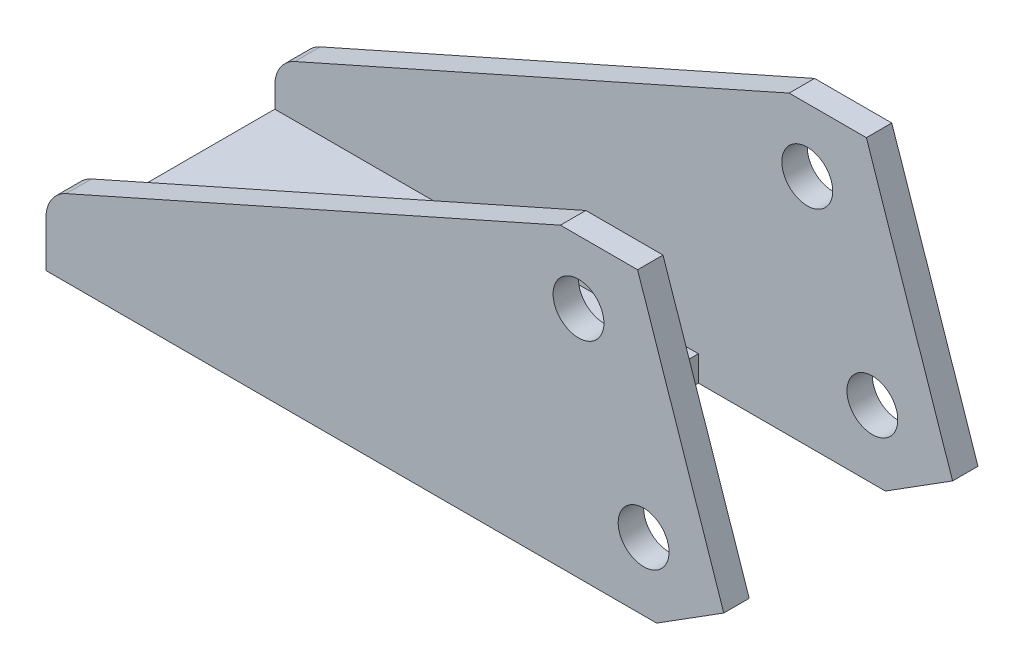
ISO-10303-21;
HEADER;
FILE_DESCRIPTION(('STEP AP214'),'2;1');
FILE_NAME('part.step','',(''),(''),'','','');
FILE_SCHEMA(('AUTOMOTIVE_DESIGN { 1 0 10303 214 1 1 1 1 }'));
ENDSEC;
DATA;
#1=APPLICATION_CONTEXT('core data for automotive mechanical design processes');
#2=APPLICATION_PROTOCOL_DEFINITION('international standard','automotive_design',2000,#1);
#3=PRODUCT_CONTEXT('',#1,'mechanical');
#4=PRODUCT('Part','Part','',(#3));
#5=PRODUCT_RELATED_PRODUCT_CATEGORY('part','',(#4));
#6=PRODUCT_DEFINITION_FORMATION('','',#4);
#7=PRODUCT_DEFINITION_CONTEXT('part definition',#1,'design');
#8=PRODUCT_DEFINITION('design','',#6,#7);
#9=PRODUCT_DEFINITION_SHAPE('','',#8);
#10=(LENGTH_UNIT() NAMED_UNIT(*) SI_UNIT(.MILLI.,.METRE.));
#11=(NAMED_UNIT(*) PLANE_ANGLE_UNIT() SI_UNIT($,.RADIAN.));
#12=(NAMED_UNIT(*) SI_UNIT($,.STERADIAN.) SOLID_ANGLE_UNIT());
#13=UNCERTAINTY_MEASURE_WITH_UNIT(LENGTH_MEASURE(1.E-05),#10,'distance_accuracy_value','');
#14=(GEOMETRIC_REPRESENTATION_CONTEXT(3) GLOBAL_UNCERTAINTY_ASSIGNED_CONTEXT((#13)) GLOBAL_UNIT_ASSIGNED_CONTEXT((#10,
#11,#12)) REPRESENTATION_CONTEXT('',''));
#15=CARTESIAN_POINT('',(0.,0.,0.));
#16=DIRECTION('',(0.,0.,1.));
#17=DIRECTION('',(1.,0.,0.));
#18=AXIS2_PLACEMENT_3D('',#15,#16,#17);
#19=CARTESIAN_POINT('',(1.18729583152566,4.52801946219611,15.));
#20=DIRECTION('',(0.406352084237173,-0.913716577301794,0.));
#21=DIRECTION('',(0.913716577301794,0.406352084237173,0.));
#22=AXIS2_PLACEMENT_3D('',#19,#20,#21);
#23=PLANE('',#22);
#24=DIRECTION('',(-0.913716577301794,-0.406352084237173,0.));
#25=VECTOR('',#24,1.);
#26=CARTESIAN_POINT('',(1.18729583152566,4.52801946219611,13.5));
#27=LINE('',#26,#25);
#28=CARTESIAN_POINT('',(30.3558767681246,17.5,13.5));
#29=VERTEX_POINT('',#28);
#30=CARTESIAN_POINT('',(1.18729583152566,4.52801946219611,13.5));
#31=VERTEX_POINT('',#30);
#32=EDGE_CURVE('E192',#29,#31,#27,.T.);
#33=ORIENTED_EDGE('',*,*,#32,.T.);
#34=DIRECTION('',(0.,0.,-1.));
#35=VECTOR('',#34,1.);
#36=CARTESIAN_POINT('',(1.18729583152566,4.52801946219611,15.));
#37=LINE('',#36,#35);
#38=CARTESIAN_POINT('',(1.18729583152566,4.52801946219611,15.));
#39=VERTEX_POINT('',#38);
#40=EDGE_CURVE('E256',#39,#31,#37,.T.);
#41=ORIENTED_EDGE('',*,*,#40,.F.);
#42=DIRECTION('',(-0.913716577301794,-0.406352084237173,0.));
#43=VECTOR('',#42,1.);
#44=CARTESIAN_POINT('',(1.18729583152566,4.52801946219611,15.));
#45=LINE('',#44,#43);
#46=CARTESIAN_POINT('',(30.3558767681246,17.5,15.));
#47=VERTEX_POINT('',#46);
#48=EDGE_CURVE('E228',#47,#39,#45,.T.);
#49=ORIENTED_EDGE('',*,*,#48,.F.);
#50=DIRECTION('',(0.,0.,-1.));
#51=VECTOR('',#50,1.);
#52=CARTESIAN_POINT('',(30.3558767681246,17.5,15.));
#53=LINE('',#52,#51);
#54=EDGE_CURVE('E260',#47,#29,#53,.T.);
#55=ORIENTED_EDGE('',*,*,#54,.T.);
#56=EDGE_LOOP('',(#33,#41,#49,#55));
#57=FACE_BOUND('',#56,.T.);
#58=ADVANCED_FACE('F32',(#57),#23,.F.);
#59=CARTESIAN_POINT('',(2.,2.70058630759251,15.));
#60=DIRECTION('',(0.,0.,-1.));
#61=DIRECTION('',(-1.,0.,0.));
#62=AXIS2_PLACEMENT_3D('',#59,#60,#61);
#63=CYLINDRICAL_SURFACE('',#62,2.);
#64=ORIENTED_EDGE('',*,*,#40,.T.);
#65=CARTESIAN_POINT('',(2.,2.70058630759251,13.5));
#66=DIRECTION('',(0.,0.,1.));
#67=DIRECTION('',(0.,-1.,0.));
#68=AXIS2_PLACEMENT_3D('',#65,#66,#67);
#69=CIRCLE('',#68,2.);
#70=CARTESIAN_POINT('',(0.,2.7005863075925,13.5));
#71=VERTEX_POINT('',#70);
#72=EDGE_CURVE('E295',#31,#71,#69,.T.);
#73=ORIENTED_EDGE('',*,*,#72,.T.);
#74=DIRECTION('',(0.,0.,-1.));
#75=VECTOR('',#74,1.);
#76=CARTESIAN_POINT('',(0.,2.7005863075925,15.));
#77=LINE('',#76,#75);
#78=CARTESIAN_POINT('',(0.,2.7005863075925,15.));
#79=VERTEX_POINT('',#78);
#80=EDGE_CURVE('E252',#79,#71,#77,.T.);
#81=ORIENTED_EDGE('',*,*,#80,.F.);
#82=CARTESIAN_POINT('',(2.,2.70058630759251,15.));
#83=DIRECTION('',(0.,0.,1.));
#84=DIRECTION('',(-1.,0.,0.));
#85=AXIS2_PLACEMENT_3D('',#82,#83,#84);
#86=CIRCLE('',#85,2.);
#87=EDGE_CURVE('E230',#39,#79,#86,.T.);
#88=ORIENTED_EDGE('',*,*,#87,.F.);
#89=EDGE_LOOP('',(#64,#73,#81,#88));
#90=FACE_BOUND('',#89,.T.);
#91=ADVANCED_FACE('F337',(#90),#63,.T.);
#92=CARTESIAN_POINT('',(40.,2.4989640423734,15.));
#93=DIRECTION('',(-0.533189503275845,0.845995835448649,0.));
#94=DIRECTION('',(-0.845995835448649,-0.533189503275845,0.));
#95=AXIS2_PLACEMENT_3D('',#92,#93,#94);
#96=PLANE('',#95);
#97=DIRECTION('',(0.,0.,-1.));
#98=VECTOR('',#97,1.);
#99=CARTESIAN_POINT('',(36.0349685059534,0.,15.));
#100=LINE('',#99,#98);
#101=CARTESIAN_POINT('',(36.0349685059534,0.,15.));
#102=VERTEX_POINT('',#101);
#103=CARTESIAN_POINT('',(36.0349685059534,0.,13.5));
#104=VERTEX_POINT('',#103);
#105=EDGE_CURVE('E41',#102,#104,#100,.T.);
#106=ORIENTED_EDGE('',*,*,#105,.T.);
#107=DIRECTION('',(0.845995835448649,0.533189503275845,0.));
#108=VECTOR('',#107,1.);
#109=CARTESIAN_POINT('',(40.,2.4989640423734,13.5));
#110=LINE('',#109,#108);
#111=CARTESIAN_POINT('',(40.,2.4989640423734,13.5));
#112=VERTEX_POINT('',#111);
#113=EDGE_CURVE('E200',#104,#112,#110,.T.);
#114=ORIENTED_EDGE('',*,*,#113,.T.);
#115=DIRECTION('',(0.,0.,-1.));
#116=VECTOR('',#115,1.);
#117=CARTESIAN_POINT('',(40.,2.4989640423734,15.));
#118=LINE('',#117,#116);
#119=CARTESIAN_POINT('',(40.,2.4989640423734,15.));
#120=VERTEX_POINT('',#119);
#121=EDGE_CURVE('E268',#120,#112,#118,.T.);
#122=ORIENTED_EDGE('',*,*,#121,.F.);
#123=DIRECTION('',(0.845995835448649,0.533189503275845,0.));
#124=VECTOR('',#123,1.);
#125=CARTESIAN_POINT('',(40.,2.4989640423734,15.));
#126=LINE('',#125,#124);
#127=EDGE_CURVE('E222',#102,#120,#126,.T.);
#128=ORIENTED_EDGE('',*,*,#127,.F.);
#129=EDGE_LOOP('',(#106,#114,#122,#128));
#130=FACE_BOUND('',#129,.T.);
#131=ADVANCED_FACE('F352',(#130),#96,.F.);
#132=CARTESIAN_POINT('',(34.9116316786905,17.5,15.));
#133=DIRECTION('',(-0.947003069873046,-0.321224509729609,0.));
#134=DIRECTION('',(0.321224509729609,-0.947003069873046,0.));
#135=AXIS2_PLACEMENT_3D('',#132,#133,#134);
#136=PLANE('',#135);
#137=ORIENTED_EDGE('',*,*,#121,.T.);
#138=DIRECTION('',(-0.321224509729609,0.947003069873046,0.));
#139=VECTOR('',#138,1.);
#140=CARTESIAN_POINT('',(34.9116316786905,17.5,13.5));
#141=LINE('',#140,#139);
#142=CARTESIAN_POINT('',(34.9116316786905,17.5,13.5));
#143=VERTEX_POINT('',#142);
#144=EDGE_CURVE('E197',#112,#143,#141,.T.);
#145=ORIENTED_EDGE('',*,*,#144,.T.);
#146=DIRECTION('',(0.,0.,-1.));
#147=VECTOR('',#146,1.);
#148=CARTESIAN_POINT('',(34.9116316786905,17.5,15.));
#149=LINE('',#148,#147);
#150=CARTESIAN_POINT('',(34.9116316786905,17.5,15.));
#151=VERTEX_POINT('',#150);
#152=EDGE_CURVE('E264',#151,#143,#149,.T.);
#153=ORIENTED_EDGE('',*,*,#152,.F.);
#154=DIRECTION('',(-0.321224509729609,0.947003069873046,0.));
#155=VECTOR('',#154,1.);
#156=CARTESIAN_POINT('',(34.9116316786905,17.5,15.));
#157=LINE('',#156,#155);
#158=EDGE_CURVE('E224',#120,#151,#157,.T.);
#159=ORIENTED_EDGE('',*,*,#158,.F.);
#160=EDGE_LOOP('',(#137,#145,#153,#159));
#161=FACE_BOUND('',#160,.T.);
#162=ADVANCED_FACE('F349',(#161),#136,.F.);
#163=CARTESIAN_POINT('',(30.3558767681246,17.5,15.));
#164=DIRECTION('',(0.,-1.,0.));
#165=DIRECTION('',(0.,0.,-1.));
#166=AXIS2_PLACEMENT_3D('',#163,#164,#165);
#167=PLANE('',#166);
#168=ORIENTED_EDGE('',*,*,#152,.T.);
#169=DIRECTION('',(-1.,0.,0.));
#170=VECTOR('',#169,1.);
#171=CARTESIAN_POINT('',(30.3558767681246,17.5,13.5));
#172=LINE('',#171,#170);
#173=EDGE_CURVE('E194',#143,#29,#172,.T.);
#174=ORIENTED_EDGE('',*,*,#173,.T.);
#175=ORIENTED_EDGE('',*,*,#54,.F.);
#176=DIRECTION('',(-1.,0.,0.));
#177=VECTOR('',#176,1.);
#178=CARTESIAN_POINT('',(30.3558767681246,17.5,15.));
#179=LINE('',#178,#177);
#180=EDGE_CURVE('E226',#151,#47,#179,.T.);
#181=ORIENTED_EDGE('',*,*,#180,.F.);
#182=EDGE_LOOP('',(#168,#174,#175,#181));
#183=FACE_BOUND('',#182,.T.);
#184=ADVANCED_FACE('F344',(#183),#167,.F.);
#185=CARTESIAN_POINT('',(35.2669957657307,4.,15.));
#186=DIRECTION('',(0.,0.,-1.));
#187=DIRECTION('',(-1.,0.,0.));
#188=AXIS2_PLACEMENT_3D('',#185,#186,#187);
#189=CYLINDRICAL_SURFACE('',#188,1.5);
#190=CARTESIAN_POINT('',(35.2669957657307,4.,13.5));
#191=DIRECTION('',(0.,0.,1.));
#192=DIRECTION('',(1.,0.,0.));
#193=AXIS2_PLACEMENT_3D('',#190,#191,#192);
#194=CIRCLE('',#193,1.5);
#195=CARTESIAN_POINT('',(36.7669957657307,4.,13.5));
#196=VERTEX_POINT('',#195);
#197=EDGE_CURVE('E189',#196,#196,#194,.T.);
#198=ORIENTED_EDGE('',*,*,#197,.F.);
#199=EDGE_LOOP('',(#198));
#200=FACE_BOUND('',#199,.T.);
#201=CARTESIAN_POINT('',(35.2669957657307,4.,15.));
#202=DIRECTION('',(0.,0.,1.));
#203=DIRECTION('',(1.,0.,0.));
#204=AXIS2_PLACEMENT_3D('',#201,#202,#203);
#205=CIRCLE('',#204,1.5);
#206=CARTESIAN_POINT('',(36.7669957657307,4.,15.));
#207=VERTEX_POINT('',#206);
#208=EDGE_CURVE('E210',#207,#207,#205,.T.);
#209=ORIENTED_EDGE('',*,*,#208,.T.);
#210=EDGE_LOOP('',(#209));
#211=FACE_BOUND('',#210,.T.);
#212=ADVANCED_FACE('F365',(#200,#211),#189,.F.);
#213=CARTESIAN_POINT('',(31.4244631502589,13.7716397344067,15.));
#214=DIRECTION('',(0.,0.,-1.));
#215=DIRECTION('',(-1.,0.,0.));
#216=AXIS2_PLACEMENT_3D('',#213,#214,#215);
#217=CYLINDRICAL_SURFACE('',#216,1.5);
#218=CARTESIAN_POINT('',(31.4244631502589,13.7716397344067,13.5));
#219=DIRECTION('',(0.,0.,1.));
#220=DIRECTION('',(1.,0.,0.));
#221=AXIS2_PLACEMENT_3D('',#218,#219,#220);
#222=CIRCLE('',#221,1.5);
#223=CARTESIAN_POINT('',(32.9244631502589,13.7716397344067,13.5));
#224=VERTEX_POINT('',#223);
#225=EDGE_CURVE('E188',#224,#224,#222,.T.);
#226=ORIENTED_EDGE('',*,*,#225,.F.);
#227=EDGE_LOOP('',(#226));
#228=FACE_BOUND('',#227,.T.);
#229=CARTESIAN_POINT('',(31.4244631502589,13.7716397344067,15.));
#230=DIRECTION('',(0.,0.,1.));
#231=DIRECTION('',(1.,0.,0.));
#232=AXIS2_PLACEMENT_3D('',#229,#230,#231);
#233=CIRCLE('',#232,1.5);
#234=CARTESIAN_POINT('',(32.9244631502589,13.7716397344067,15.));
#235=VERTEX_POINT('',#234);
#236=EDGE_CURVE('E204',#235,#235,#233,.T.);
#237=ORIENTED_EDGE('',*,*,#236,.T.);
#238=EDGE_LOOP('',(#237));
#239=FACE_BOUND('',#238,.T.);
#240=ADVANCED_FACE('F359',(#228,#239),#217,.F.);
#241=CARTESIAN_POINT('',(2.,2.70058630759251,15.));
#242=DIRECTION('',(0.,0.,-1.));
#243=DIRECTION('',(-1.,0.,0.));
#244=AXIS2_PLACEMENT_3D('',#241,#242,#243);
#245=PLANE('',#244);
#246=ORIENTED_EDGE('',*,*,#208,.F.);
#247=EDGE_LOOP('',(#246));
#248=FACE_BOUND('',#247,.T.);
#249=DIRECTION('',(0.,-1.,0.));
#250=VECTOR('',#249,1.);
#251=CARTESIAN_POINT('',(0.,0.,15.));
#252=LINE('',#251,#250);
#253=CARTESIAN_POINT('',(0.,0.,15.));
#254=VERTEX_POINT('',#253);
#255=EDGE_CURVE('E216',#79,#254,#252,.T.);
#256=ORIENTED_EDGE('',*,*,#255,.T.);
#257=DIRECTION('',(1.,0.,0.));
#258=VECTOR('',#257,1.);
#259=CARTESIAN_POINT('',(0.,0.,15.));
#260=LINE('',#259,#258);
#261=EDGE_CURVE('E219',#254,#102,#260,.T.);
#262=ORIENTED_EDGE('',*,*,#261,.T.);
#263=ORIENTED_EDGE('',*,*,#127,.T.);
#264=ORIENTED_EDGE('',*,*,#158,.T.);
#265=ORIENTED_EDGE('',*,*,#180,.T.);
#266=ORIENTED_EDGE('',*,*,#48,.T.);
#267=ORIENTED_EDGE('',*,*,#87,.T.);
#268=EDGE_LOOP('',(#256,#262,#263,#264,#265,#266,#267));
#269=FACE_BOUND('',#268,.T.);
#270=ORIENTED_EDGE('',*,*,#236,.F.);
#271=EDGE_LOOP('',(#270));
#272=FACE_BOUND('',#271,.T.);
#273=ADVANCED_FACE('F356',(#248,#269,#272),#245,.F.);
#274=CARTESIAN_POINT('',(2.,2.70058630759251,0.));
#275=DIRECTION('',(0.,0.,-1.));
#276=DIRECTION('',(-1.,0.,0.));
#277=AXIS2_PLACEMENT_3D('',#274,#275,#276);
#278=PLANE('',#277);
#279=CARTESIAN_POINT('',(35.2669957657307,4.,0.));
#280=DIRECTION('',(0.,0.,1.));
#281=DIRECTION('',(1.,0.,0.));
#282=AXIS2_PLACEMENT_3D('',#279,#280,#281);
#283=CIRCLE('',#282,1.5);
#284=CARTESIAN_POINT('',(36.7669957657307,4.,0.));
#285=VERTEX_POINT('',#284);
#286=EDGE_CURVE('E207',#285,#285,#283,.T.);
#287=ORIENTED_EDGE('',*,*,#286,.T.);
#288=EDGE_LOOP('',(#287));
#289=FACE_BOUND('',#288,.T.);
#290=DIRECTION('',(0.,-1.,0.));
#291=VECTOR('',#290,1.);
#292=CARTESIAN_POINT('',(0.,0.,0.));
#293=LINE('',#292,#291);
#294=CARTESIAN_POINT('',(0.,2.7005863075925,0.));
#295=VERTEX_POINT('',#294);
#296=CARTESIAN_POINT('',(0.,0.,0.));
#297=VERTEX_POINT('',#296);
#298=EDGE_CURVE('E213',#295,#297,#293,.T.);
#299=ORIENTED_EDGE('',*,*,#298,.F.);
#300=CARTESIAN_POINT('',(2.,2.70058630759251,0.));
#301=DIRECTION('',(0.,0.,1.));
#302=DIRECTION('',(-1.,0.,0.));
#303=AXIS2_PLACEMENT_3D('',#300,#301,#302);
#304=CIRCLE('',#303,2.);
#305=CARTESIAN_POINT('',(1.18729583152566,4.52801946219611,0.));
#306=VERTEX_POINT('',#305);
#307=EDGE_CURVE('E220',#306,#295,#304,.T.);
#308=ORIENTED_EDGE('',*,*,#307,.F.);
#309=DIRECTION('',(-0.913716577301794,-0.406352084237173,0.));
#310=VECTOR('',#309,1.);
#311=CARTESIAN_POINT('',(1.18729583152566,4.52801946219611,0.));
#312=LINE('',#311,#310);
#313=CARTESIAN_POINT('',(30.3558767681246,17.5,0.));
#314=VERTEX_POINT('',#313);
#315=EDGE_CURVE('E247',#314,#306,#312,.T.);
#316=ORIENTED_EDGE('',*,*,#315,.F.);
#317=DIRECTION('',(-1.,0.,0.));
#318=VECTOR('',#317,1.);
#319=CARTESIAN_POINT('',(30.3558767681246,17.5,0.));
#320=LINE('',#319,#318);
#321=CARTESIAN_POINT('',(34.9116316786905,17.5,0.));
#322=VERTEX_POINT('',#321);
#323=EDGE_CURVE('E244',#322,#314,#320,.T.);
#324=ORIENTED_EDGE('',*,*,#323,.F.);
#325=DIRECTION('',(-0.321224509729609,0.947003069873046,0.));
#326=VECTOR('',#325,1.);
#327=CARTESIAN_POINT('',(34.9116316786905,17.5,0.));
#328=LINE('',#327,#326);
#329=CARTESIAN_POINT('',(40.,2.4989640423734,0.));
#330=VERTEX_POINT('',#329);
#331=EDGE_CURVE('E241',#330,#322,#328,.T.);
#332=ORIENTED_EDGE('',*,*,#331,.F.);
#333=DIRECTION('',(0.845995835448649,0.533189503275845,0.));
#334=VECTOR('',#333,1.);
#335=CARTESIAN_POINT('',(40.,2.4989640423734,0.));
#336=LINE('',#335,#334);
#337=CARTESIAN_POINT('',(36.0349685059534,0.,0.));
#338=VERTEX_POINT('',#337);
#339=EDGE_CURVE('E238',#338,#330,#336,.T.);
#340=ORIENTED_EDGE('',*,*,#339,.F.);
#341=DIRECTION('',(1.,0.,0.));
#342=VECTOR('',#341,1.);
#343=CARTESIAN_POINT('',(0.,0.,0.));
#344=LINE('',#343,#342);
#345=EDGE_CURVE('E235',#297,#338,#344,.T.);
#346=ORIENTED_EDGE('',*,*,#345,.F.);
#347=EDGE_LOOP('',(#299,#308,#316,#324,#332,#340,#346));
#348=FACE_BOUND('',#347,.T.);
#349=CARTESIAN_POINT('',(31.4244631502589,13.7716397344067,0.));
#350=DIRECTION('',(0.,0.,1.));
#351=DIRECTION('',(1.,0.,0.));
#352=AXIS2_PLACEMENT_3D('',#349,#350,#351);
#353=CIRCLE('',#352,1.5);
#354=CARTESIAN_POINT('',(32.9244631502589,13.7716397344067,0.));
#355=VERTEX_POINT('',#354);
#356=EDGE_CURVE('E203',#355,#355,#353,.T.);
#357=ORIENTED_EDGE('',*,*,#356,.T.);
#358=EDGE_LOOP('',(#357));
#359=FACE_BOUND('',#358,.T.);
#360=ADVANCED_FACE('F315',(#289,#348,#359),#278,.T.);
#361=CARTESIAN_POINT('',(0.,0.,15.));
#362=DIRECTION('',(1.,0.,0.));
#363=DIRECTION('',(0.,0.,-1.));
#364=AXIS2_PLACEMENT_3D('',#361,#362,#363);
#365=PLANE('',#364);
#366=ORIENTED_EDGE('',*,*,#80,.T.);
#367=DIRECTION('',(0.,-1.,0.));
#368=VECTOR('',#367,1.);
#369=CARTESIAN_POINT('',(0.,0.,13.5));
#370=LINE('',#369,#368);
#371=CARTESIAN_POINT('',(0.,1.5,13.5));
#372=VERTEX_POINT('',#371);
#373=EDGE_CURVE('E298',#71,#372,#370,.T.);
#374=ORIENTED_EDGE('',*,*,#373,.T.);
#375=DIRECTION('',(0.,0.,-1.));
#376=VECTOR('',#375,1.);
#377=CARTESIAN_POINT('',(0.,1.5,15.));
#378=LINE('',#377,#376);
#379=CARTESIAN_POINT('',(0.,1.5,1.5));
#380=VERTEX_POINT('',#379);
#381=EDGE_CURVE('E149',#372,#380,#378,.T.);
#382=ORIENTED_EDGE('',*,*,#381,.T.);
#383=DIRECTION('',(0.,1.,0.));
#384=VECTOR('',#383,1.);
#385=CARTESIAN_POINT('',(0.,0.,1.5));
#386=LINE('',#385,#384);
#387=CARTESIAN_POINT('',(0.,2.7005863075925,1.5));
#388=VERTEX_POINT('',#387);
#389=EDGE_CURVE('E292',#380,#388,#386,.T.);
#390=ORIENTED_EDGE('',*,*,#389,.T.);
#391=EDGE_CURVE('E232',#388,#295,#77,.T.);
#392=ORIENTED_EDGE('',*,*,#391,.T.);
#393=ORIENTED_EDGE('',*,*,#298,.T.);
#394=DIRECTION('',(0.,0.,-1.));
#395=VECTOR('',#394,1.);
#396=CARTESIAN_POINT('',(0.,0.,15.));
#397=LINE('',#396,#395);
#398=EDGE_CURVE('E11',#254,#297,#397,.T.);
#399=ORIENTED_EDGE('',*,*,#398,.F.);
#400=ORIENTED_EDGE('',*,*,#255,.F.);
#401=EDGE_LOOP('',(#366,#374,#382,#390,#392,#393,#399,#400));
#402=FACE_BOUND('',#401,.T.);
#403=ADVANCED_FACE('F34',(#402),#365,.F.);
#404=CARTESIAN_POINT('',(0.,0.,15.));
#405=DIRECTION('',(0.,1.,0.));
#406=DIRECTION('',(0.,0.,1.));
#407=AXIS2_PLACEMENT_3D('',#404,#405,#406);
#408=PLANE('',#407);
#409=CARTESIAN_POINT('',(20.,0.,7.5));
#410=DIRECTION('',(0.,-1.,0.));
#411=DIRECTION('',(0.,0.,-1.));
#412=AXIS2_PLACEMENT_3D('',#409,#410,#411);
#413=CIRCLE('',#412,1.5);
#414=CARTESIAN_POINT('',(20.,0.,6.));
#415=VERTEX_POINT('',#414);
#416=EDGE_CURVE('E284',#415,#415,#413,.T.);
#417=ORIENTED_EDGE('',*,*,#416,.F.);
#418=EDGE_LOOP('',(#417));
#419=FACE_BOUND('',#418,.T.);
#420=CARTESIAN_POINT('',(8.,0.,7.5));
#421=DIRECTION('',(0.,-1.,0.));
#422=DIRECTION('',(0.,0.,-1.));
#423=AXIS2_PLACEMENT_3D('',#420,#421,#422);
#424=CIRCLE('',#423,1.5);
#425=CARTESIAN_POINT('',(8.,0.,6.));
#426=VERTEX_POINT('',#425);
#427=EDGE_CURVE('E276',#426,#426,#424,.T.);
#428=ORIENTED_EDGE('',*,*,#427,.F.);
#429=EDGE_LOOP('',(#428));
#430=FACE_BOUND('',#429,.T.);
#431=DIRECTION('',(0.,0.,-1.));
#432=VECTOR('',#431,1.);
#433=CARTESIAN_POINT('',(25.,0.,13.5));
#434=LINE('',#433,#432);
#435=CARTESIAN_POINT('',(25.,0.,13.5));
#436=VERTEX_POINT('',#435);
#437=CARTESIAN_POINT('',(25.,0.,1.5));
#438=VERTEX_POINT('',#437);
#439=EDGE_CURVE('E300',#436,#438,#434,.T.);
#440=ORIENTED_EDGE('',*,*,#439,.F.);
#441=DIRECTION('',(-1.,0.,0.));
#442=VECTOR('',#441,1.);
#443=CARTESIAN_POINT('',(25.,0.,13.5));
#444=LINE('',#443,#442);
#445=EDGE_CURVE('E166',#104,#436,#444,.T.);
#446=ORIENTED_EDGE('',*,*,#445,.F.);
#447=ORIENTED_EDGE('',*,*,#105,.F.);
#448=ORIENTED_EDGE('',*,*,#261,.F.);
#449=ORIENTED_EDGE('',*,*,#398,.T.);
#450=ORIENTED_EDGE('',*,*,#345,.T.);
#451=CARTESIAN_POINT('',(36.0349685059534,0.,1.5));
#452=VERTEX_POINT('',#451);
#453=EDGE_CURVE('E271',#452,#338,#100,.T.);
#454=ORIENTED_EDGE('',*,*,#453,.F.);
#455=DIRECTION('',(1.,0.,0.));
#456=VECTOR('',#455,1.);
#457=CARTESIAN_POINT('',(25.,0.,1.5));
#458=LINE('',#457,#456);
#459=EDGE_CURVE('E301',#438,#452,#458,.T.);
#460=ORIENTED_EDGE('',*,*,#459,.F.);
#461=EDGE_LOOP('',(#440,#446,#447,#448,#449,#450,#454,#460));
#462=FACE_BOUND('',#461,.T.);
#463=ADVANCED_FACE('F309',(#419,#430,#462),#408,.F.);
#464=CARTESIAN_POINT('',(40.,2.4989640423734,1.5));
#465=VERTEX_POINT('',#464);
#466=EDGE_CURVE('E267',#465,#330,#118,.T.);
#467=ORIENTED_EDGE('',*,*,#466,.F.);
#468=DIRECTION('',(-0.845995835448649,-0.533189503275845,0.));
#469=VECTOR('',#468,1.);
#470=CARTESIAN_POINT('',(40.,2.4989640423734,1.5));
#471=LINE('',#470,#469);
#472=EDGE_CURVE('E185',#465,#452,#471,.T.);
#473=ORIENTED_EDGE('',*,*,#472,.T.);
#474=ORIENTED_EDGE('',*,*,#453,.T.);
#475=ORIENTED_EDGE('',*,*,#339,.T.);
#476=EDGE_LOOP('',(#467,#473,#474,#475));
#477=FACE_BOUND('',#476,.T.);
#478=ADVANCED_FACE('F308',(#477),#96,.F.);
#479=CARTESIAN_POINT('',(34.9116316786905,17.5,1.5));
#480=VERTEX_POINT('',#479);
#481=EDGE_CURVE('E263',#480,#322,#149,.T.);
#482=ORIENTED_EDGE('',*,*,#481,.F.);
#483=DIRECTION('',(0.321224509729609,-0.947003069873046,0.));
#484=VECTOR('',#483,1.);
#485=CARTESIAN_POINT('',(34.9116316786905,17.5,1.5));
#486=LINE('',#485,#484);
#487=EDGE_CURVE('E182',#480,#465,#486,.T.);
#488=ORIENTED_EDGE('',*,*,#487,.T.);
#489=ORIENTED_EDGE('',*,*,#466,.T.);
#490=ORIENTED_EDGE('',*,*,#331,.T.);
#491=EDGE_LOOP('',(#482,#488,#489,#490));
#492=FACE_BOUND('',#491,.T.);
#493=ADVANCED_FACE('F321',(#492),#136,.F.);
#494=CARTESIAN_POINT('',(30.3558767681246,17.5,1.5));
#495=VERTEX_POINT('',#494);
#496=EDGE_CURVE('E259',#495,#314,#53,.T.);
#497=ORIENTED_EDGE('',*,*,#496,.F.);
#498=DIRECTION('',(1.,0.,0.));
#499=VECTOR('',#498,1.);
#500=CARTESIAN_POINT('',(30.3558767681246,17.5,1.5));
#501=LINE('',#500,#499);
#502=EDGE_CURVE('E57',#495,#480,#501,.T.);
#503=ORIENTED_EDGE('',*,*,#502,.T.);
#504=ORIENTED_EDGE('',*,*,#481,.T.);
#505=ORIENTED_EDGE('',*,*,#323,.T.);
#506=EDGE_LOOP('',(#497,#503,#504,#505));
#507=FACE_BOUND('',#506,.T.);
#508=ADVANCED_FACE('F324',(#507),#167,.F.);
#509=CARTESIAN_POINT('',(1.18729583152566,4.52801946219611,1.5));
#510=VERTEX_POINT('',#509);
#511=EDGE_CURVE('E255',#510,#306,#37,.T.);
#512=ORIENTED_EDGE('',*,*,#511,.F.);
#513=DIRECTION('',(0.913716577301794,0.406352084237173,0.));
#514=VECTOR('',#513,1.);
#515=CARTESIAN_POINT('',(1.18729583152566,4.52801946219611,1.5));
#516=LINE('',#515,#514);
#517=EDGE_CURVE('E179',#510,#495,#516,.T.);
#518=ORIENTED_EDGE('',*,*,#517,.T.);
#519=ORIENTED_EDGE('',*,*,#496,.T.);
#520=ORIENTED_EDGE('',*,*,#315,.T.);
#521=EDGE_LOOP('',(#512,#518,#519,#520));
#522=FACE_BOUND('',#521,.T.);
#523=ADVANCED_FACE('F327',(#522),#23,.F.);
#524=ORIENTED_EDGE('',*,*,#391,.F.);
#525=CARTESIAN_POINT('',(2.,2.70058630759251,1.5));
#526=DIRECTION('',(0.,0.,-1.));
#527=DIRECTION('',(0.,1.,0.));
#528=AXIS2_PLACEMENT_3D('',#525,#526,#527);
#529=CIRCLE('',#528,2.);
#530=EDGE_CURVE('E289',#388,#510,#529,.T.);
#531=ORIENTED_EDGE('',*,*,#530,.T.);
#532=ORIENTED_EDGE('',*,*,#511,.T.);
#533=ORIENTED_EDGE('',*,*,#307,.T.);
#534=EDGE_LOOP('',(#524,#531,#532,#533));
#535=FACE_BOUND('',#534,.T.);
#536=ADVANCED_FACE('F331',(#535),#63,.T.);
#537=CARTESIAN_POINT('',(35.2669957657307,4.,1.5));
#538=DIRECTION('',(0.,0.,-1.));
#539=DIRECTION('',(-1.,0.,0.));
#540=AXIS2_PLACEMENT_3D('',#537,#538,#539);
#541=CIRCLE('',#540,1.5);
#542=CARTESIAN_POINT('',(33.7669957657307,4.,1.5));
#543=VERTEX_POINT('',#542);
#544=EDGE_CURVE('E171',#543,#543,#541,.T.);
#545=ORIENTED_EDGE('',*,*,#544,.F.);
#546=EDGE_LOOP('',(#545));
#547=FACE_BOUND('',#546,.T.);
#548=ORIENTED_EDGE('',*,*,#286,.F.);
#549=EDGE_LOOP('',(#548));
#550=FACE_BOUND('',#549,.T.);
#551=ADVANCED_FACE('F374',(#547,#550),#189,.F.);
#552=CARTESIAN_POINT('',(31.4244631502589,13.7716397344067,1.5));
#553=DIRECTION('',(0.,0.,-1.));
#554=DIRECTION('',(-1.,0.,0.));
#555=AXIS2_PLACEMENT_3D('',#552,#553,#554);
#556=CIRCLE('',#555,1.5);
#557=CARTESIAN_POINT('',(29.9244631502589,13.7716397344067,1.5));
#558=VERTEX_POINT('',#557);
#559=EDGE_CURVE('E168',#558,#558,#556,.T.);
#560=ORIENTED_EDGE('',*,*,#559,.F.);
#561=EDGE_LOOP('',(#560));
#562=FACE_BOUND('',#561,.T.);
#563=ORIENTED_EDGE('',*,*,#356,.F.);
#564=EDGE_LOOP('',(#563));
#565=FACE_BOUND('',#564,.T.);
#566=ADVANCED_FACE('F368',(#562,#565),#217,.F.);
#567=CARTESIAN_POINT('',(25.,50.,13.5));
#568=DIRECTION('',(-1.,0.,0.));
#569=DIRECTION('',(0.,0.,1.));
#570=AXIS2_PLACEMENT_3D('',#567,#568,#569);
#571=PLANE('',#570);
#572=DIRECTION('',(0.,-1.,0.));
#573=VECTOR('',#572,1.);
#574=CARTESIAN_POINT('',(25.,50.,1.5));
#575=LINE('',#574,#573);
#576=CARTESIAN_POINT('',(25.,1.5,1.5));
#577=VERTEX_POINT('',#576);
#578=EDGE_CURVE('E161',#577,#438,#575,.T.);
#579=ORIENTED_EDGE('',*,*,#578,.F.);
#580=DIRECTION('',(0.,0.,-1.));
#581=VECTOR('',#580,1.);
#582=CARTESIAN_POINT('',(25.,1.5,13.5));
#583=LINE('',#582,#581);
#584=CARTESIAN_POINT('',(25.,1.5,13.5));
#585=VERTEX_POINT('',#584);
#586=EDGE_CURVE('E49',#585,#577,#583,.T.);
#587=ORIENTED_EDGE('',*,*,#586,.F.);
#588=DIRECTION('',(0.,-1.,0.));
#589=VECTOR('',#588,1.);
#590=CARTESIAN_POINT('',(25.,50.,13.5));
#591=LINE('',#590,#589);
#592=EDGE_CURVE('E159',#585,#436,#591,.T.);
#593=ORIENTED_EDGE('',*,*,#592,.T.);
#594=ORIENTED_EDGE('',*,*,#439,.T.);
#595=EDGE_LOOP('',(#579,#587,#593,#594));
#596=FACE_BOUND('',#595,.T.);
#597=ADVANCED_FACE('F157',(#596),#571,.F.);
#598=CARTESIAN_POINT('',(25.,50.,13.5));
#599=DIRECTION('',(0.,0.,1.));
#600=DIRECTION('',(1.,0.,0.));
#601=AXIS2_PLACEMENT_3D('',#598,#599,#600);
#602=PLANE('',#601);
#603=ORIENTED_EDGE('',*,*,#225,.T.);
#604=EDGE_LOOP('',(#603));
#605=FACE_BOUND('',#604,.T.);
#606=ORIENTED_EDGE('',*,*,#197,.T.);
#607=EDGE_LOOP('',(#606));
#608=FACE_BOUND('',#607,.T.);
#609=ORIENTED_EDGE('',*,*,#445,.T.);
#610=ORIENTED_EDGE('',*,*,#592,.F.);
#611=DIRECTION('',(1.,0.,0.));
#612=VECTOR('',#611,1.);
#613=CARTESIAN_POINT('',(-25.,1.5,13.5));
#614=LINE('',#613,#612);
#615=EDGE_CURVE('E146',#372,#585,#614,.T.);
#616=ORIENTED_EDGE('',*,*,#615,.F.);
#617=ORIENTED_EDGE('',*,*,#373,.F.);
#618=ORIENTED_EDGE('',*,*,#72,.F.);
#619=ORIENTED_EDGE('',*,*,#32,.F.);
#620=ORIENTED_EDGE('',*,*,#173,.F.);
#621=ORIENTED_EDGE('',*,*,#144,.F.);
#622=ORIENTED_EDGE('',*,*,#113,.F.);
#623=EDGE_LOOP('',(#609,#610,#616,#617,#618,#619,#620,#621,#622));
#624=FACE_BOUND('',#623,.T.);
#625=ADVANCED_FACE('F164',(#605,#608,#624),#602,.F.);
#626=CARTESIAN_POINT('',(25.,50.,1.5));
#627=DIRECTION('',(0.,0.,-1.));
#628=DIRECTION('',(-1.,0.,0.));
#629=AXIS2_PLACEMENT_3D('',#626,#627,#628);
#630=PLANE('',#629);
#631=ORIENTED_EDGE('',*,*,#559,.T.);
#632=EDGE_LOOP('',(#631));
#633=FACE_BOUND('',#632,.T.);
#634=ORIENTED_EDGE('',*,*,#544,.T.);
#635=EDGE_LOOP('',(#634));
#636=FACE_BOUND('',#635,.T.);
#637=ORIENTED_EDGE('',*,*,#487,.F.);
#638=ORIENTED_EDGE('',*,*,#502,.F.);
#639=ORIENTED_EDGE('',*,*,#517,.F.);
#640=ORIENTED_EDGE('',*,*,#530,.F.);
#641=ORIENTED_EDGE('',*,*,#389,.F.);
#642=DIRECTION('',(1.,0.,0.));
#643=VECTOR('',#642,1.);
#644=CARTESIAN_POINT('',(-25.,1.5,1.5));
#645=LINE('',#644,#643);
#646=EDGE_CURVE('E153',#380,#577,#645,.T.);
#647=ORIENTED_EDGE('',*,*,#646,.T.);
#648=ORIENTED_EDGE('',*,*,#578,.T.);
#649=ORIENTED_EDGE('',*,*,#459,.T.);
#650=ORIENTED_EDGE('',*,*,#472,.F.);
#651=EDGE_LOOP('',(#637,#638,#639,#640,#641,#647,#648,#649,#650));
#652=FACE_BOUND('',#651,.T.);
#653=ADVANCED_FACE('F303',(#633,#636,#652),#630,.F.);
#654=CARTESIAN_POINT('',(-25.,1.5,13.5));
#655=DIRECTION('',(0.,-1.,0.));
#656=DIRECTION('',(0.,0.,-1.));
#657=AXIS2_PLACEMENT_3D('',#654,#655,#656);
#658=PLANE('',#657);
#659=CARTESIAN_POINT('',(20.,1.5,7.5));
#660=DIRECTION('',(0.,-1.,0.));
#661=DIRECTION('',(0.,0.,-1.));
#662=AXIS2_PLACEMENT_3D('',#659,#660,#661);
#663=CIRCLE('',#662,1.5);
#664=CARTESIAN_POINT('',(20.,1.5,6.));
#665=VERTEX_POINT('',#664);
#666=EDGE_CURVE('E36',#665,#665,#663,.T.);
#667=ORIENTED_EDGE('',*,*,#666,.T.);
#668=EDGE_LOOP('',(#667));
#669=FACE_BOUND('',#668,.T.);
#670=CARTESIAN_POINT('',(8.,1.5,7.5));
#671=DIRECTION('',(0.,-1.,0.));
#672=DIRECTION('',(0.,0.,-1.));
#673=AXIS2_PLACEMENT_3D('',#670,#671,#672);
#674=CIRCLE('',#673,1.5);
#675=CARTESIAN_POINT('',(8.,1.5,6.));
#676=VERTEX_POINT('',#675);
#677=EDGE_CURVE('E162',#676,#676,#674,.T.);
#678=ORIENTED_EDGE('',*,*,#677,.T.);
#679=EDGE_LOOP('',(#678));
#680=FACE_BOUND('',#679,.T.);
#681=ORIENTED_EDGE('',*,*,#615,.T.);
#682=ORIENTED_EDGE('',*,*,#586,.T.);
#683=ORIENTED_EDGE('',*,*,#646,.F.);
#684=ORIENTED_EDGE('',*,*,#381,.F.);
#685=EDGE_LOOP('',(#681,#682,#683,#684));
#686=FACE_BOUND('',#685,.T.);
#687=ADVANCED_FACE('F147',(#669,#680,#686),#658,.F.);
#688=CARTESIAN_POINT('',(8.,50.,7.5));
#689=DIRECTION('',(0.,-1.,0.));
#690=DIRECTION('',(0.,0.,-1.));
#691=AXIS2_PLACEMENT_3D('',#688,#689,#690);
#692=CYLINDRICAL_SURFACE('',#691,1.5);
#693=ORIENTED_EDGE('',*,*,#427,.T.);
#694=EDGE_LOOP('',(#693));
#695=FACE_BOUND('',#694,.T.);
#696=ORIENTED_EDGE('',*,*,#677,.F.);
#697=EDGE_LOOP('',(#696));
#698=FACE_BOUND('',#697,.T.);
#699=ADVANCED_FACE('F416',(#695,#698),#692,.F.);
#700=CARTESIAN_POINT('',(20.,50.,7.5));
#701=DIRECTION('',(0.,-1.,0.));
#702=DIRECTION('',(0.,0.,-1.));
#703=AXIS2_PLACEMENT_3D('',#700,#701,#702);
#704=CYLINDRICAL_SURFACE('',#703,1.5);
#705=ORIENTED_EDGE('',*,*,#416,.T.);
#706=EDGE_LOOP('',(#705));
#707=FACE_BOUND('',#706,.T.);
#708=ORIENTED_EDGE('',*,*,#666,.F.);
#709=EDGE_LOOP('',(#708));
#710=FACE_BOUND('',#709,.T.);
#711=ADVANCED_FACE('F413',(#707,#710),#704,.F.);
#712=CLOSED_SHELL('',(#58,#91,#131,#162,#184,#212,#240,#273,#360,#403,#463,#478,#493,#508,#523,
#536,#551,#566,#597,#625,#653,#687,#699,#711));
#713=MANIFOLD_SOLID_BREP('B2',#712);
#714=ADVANCED_BREP_SHAPE_REPRESENTATION('',(#18,#713),#14);
#715=SHAPE_DEFINITION_REPRESENTATION(#9,#714);
ENDSEC;
END-ISO-10303-21;
